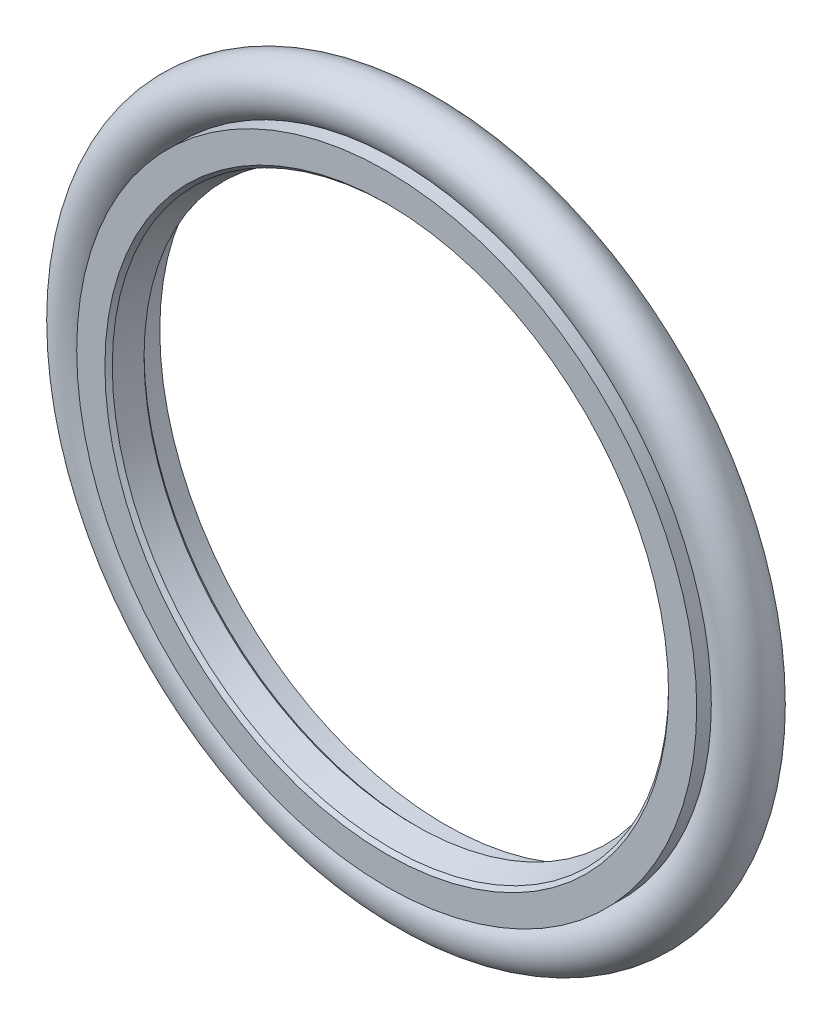
ISO-10303-21;
HEADER;
FILE_DESCRIPTION(('STEP AP214'),'2;1');
FILE_NAME('part.step','',(''),(''),'','','');
FILE_SCHEMA(('AUTOMOTIVE_DESIGN { 1 0 10303 214 1 1 1 1 }'));
ENDSEC;
DATA;
#1=APPLICATION_CONTEXT('core data for automotive mechanical design processes');
#2=APPLICATION_PROTOCOL_DEFINITION('international standard','automotive_design',2000,#1);
#3=PRODUCT_CONTEXT('',#1,'mechanical');
#4=PRODUCT('Part','Part','',(#3));
#5=PRODUCT_RELATED_PRODUCT_CATEGORY('part','',(#4));
#6=PRODUCT_DEFINITION_FORMATION('','',#4);
#7=PRODUCT_DEFINITION_CONTEXT('part definition',#1,'design');
#8=PRODUCT_DEFINITION('design','',#6,#7);
#9=PRODUCT_DEFINITION_SHAPE('','',#8);
#10=(LENGTH_UNIT() NAMED_UNIT(*) SI_UNIT(.MILLI.,.METRE.));
#11=(NAMED_UNIT(*) PLANE_ANGLE_UNIT() SI_UNIT($,.RADIAN.));
#12=(NAMED_UNIT(*) SI_UNIT($,.STERADIAN.) SOLID_ANGLE_UNIT());
#13=UNCERTAINTY_MEASURE_WITH_UNIT(LENGTH_MEASURE(1.E-05),#10,'distance_accuracy_value','');
#14=(GEOMETRIC_REPRESENTATION_CONTEXT(3) GLOBAL_UNCERTAINTY_ASSIGNED_CONTEXT((#13)) GLOBAL_UNIT_ASSIGNED_CONTEXT((#10,
#11,#12)) REPRESENTATION_CONTEXT('',''));
#15=CARTESIAN_POINT('',(0.,0.,0.));
#16=DIRECTION('',(0.,0.,1.));
#17=DIRECTION('',(1.,0.,0.));
#18=AXIS2_PLACEMENT_3D('',#15,#16,#17);
#19=CARTESIAN_POINT('',(0.,0.,1.975));
#20=DIRECTION('',(0.,0.,-1.));
#21=DIRECTION('',(-1.,0.,0.));
#22=AXIS2_PLACEMENT_3D('',#19,#20,#21);
#23=TOROIDAL_SURFACE('',#22,22.405,1.765);
#24=CARTESIAN_POINT('',(-24.17,0.,1.975));
#25=VERTEX_POINT('',#24);
#26=VERTEX_LOOP('',#25);
#27=FACE_BOUND('',#26,.T.);
#28=ADVANCED_FACE('F49',(#27),#23,.T.);
#29=CLOSED_SHELL('',(#28));
#30=MANIFOLD_SOLID_BREP('B2',#29);
#31=CARTESIAN_POINT('',(0.,0.,0.));
#32=DIRECTION('',(0.,0.,-1.));
#33=DIRECTION('',(-1.,0.,0.));
#34=AXIS2_PLACEMENT_3D('',#31,#32,#33);
#35=CYLINDRICAL_SURFACE('',#34,19.25);
#36=CARTESIAN_POINT('',(0.,0.,0.));
#37=DIRECTION('',(0.,0.,-1.));
#38=DIRECTION('',(-1.,0.,0.));
#39=AXIS2_PLACEMENT_3D('',#36,#37,#38);
#40=CIRCLE('',#39,19.25);
#41=CARTESIAN_POINT('',(-19.25,0.,0.));
#42=VERTEX_POINT('',#41);
#43=EDGE_CURVE('E97',#42,#42,#40,.T.);
#44=ORIENTED_EDGE('',*,*,#43,.T.);
#45=EDGE_LOOP('',(#44));
#46=FACE_BOUND('',#45,.T.);
#47=CARTESIAN_POINT('',(0.,0.,1.56));
#48=DIRECTION('',(0.,0.,-1.));
#49=DIRECTION('',(-1.,0.,0.));
#50=AXIS2_PLACEMENT_3D('',#47,#48,#49);
#51=CIRCLE('',#50,19.25);
#52=CARTESIAN_POINT('',(-19.25,0.,1.56));
#53=VERTEX_POINT('',#52);
#54=EDGE_CURVE('E48',#53,#53,#51,.T.);
#55=ORIENTED_EDGE('',*,*,#54,.F.);
#56=EDGE_LOOP('',(#55));
#57=FACE_BOUND('',#56,.T.);
#58=ADVANCED_FACE('F66',(#46,#57),#35,.F.);
#59=CARTESIAN_POINT('',(0.,0.,1.56));
#60=DIRECTION('',(0.,0.,-1.));
#61=DIRECTION('',(-1.,0.,0.));
#62=AXIS2_PLACEMENT_3D('',#59,#60,#61);
#63=TOROIDAL_SURFACE('',#62,19.,0.25);
#64=ORIENTED_EDGE('',*,*,#54,.T.);
#65=EDGE_LOOP('',(#64));
#66=FACE_BOUND('',#65,.T.);
#67=CARTESIAN_POINT('',(0.,0.,1.81));
#68=DIRECTION('',(0.,0.,-1.));
#69=DIRECTION('',(-1.,0.,0.));
#70=AXIS2_PLACEMENT_3D('',#67,#68,#69);
#71=CIRCLE('',#70,19.);
#72=CARTESIAN_POINT('',(-19.,0.,1.81));
#73=VERTEX_POINT('',#72);
#74=EDGE_CURVE('E72',#73,#73,#71,.T.);
#75=ORIENTED_EDGE('',*,*,#74,.F.);
#76=EDGE_LOOP('',(#75));
#77=FACE_BOUND('',#76,.T.);
#78=ADVANCED_FACE('F115',(#66,#77),#63,.F.);
#79=CARTESIAN_POINT('',(0.,18.5,1.81));
#80=DIRECTION('',(0.,0.,-1.));
#81=DIRECTION('',(-1.,0.,0.));
#82=AXIS2_PLACEMENT_3D('',#79,#80,#81);
#83=PLANE('',#82);
#84=ORIENTED_EDGE('',*,*,#74,.T.);
#85=EDGE_LOOP('',(#84));
#86=FACE_BOUND('',#85,.T.);
#87=CARTESIAN_POINT('',(0.,0.,1.81));
#88=DIRECTION('',(0.,0.,-1.));
#89=DIRECTION('',(-1.,0.,0.));
#90=AXIS2_PLACEMENT_3D('',#87,#88,#89);
#91=CIRCLE('',#90,18.5);
#92=CARTESIAN_POINT('',(-18.5,0.,1.81));
#93=VERTEX_POINT('',#92);
#94=EDGE_CURVE('E76',#93,#93,#91,.T.);
#95=ORIENTED_EDGE('',*,*,#94,.F.);
#96=EDGE_LOOP('',(#95));
#97=FACE_BOUND('',#96,.T.);
#98=ADVANCED_FACE('F119',(#86,#97),#83,.T.);
#99=CARTESIAN_POINT('',(0.,0.,2.06));
#100=DIRECTION('',(0.,0.,-1.));
#101=DIRECTION('',(-1.,0.,0.));
#102=AXIS2_PLACEMENT_3D('',#99,#100,#101);
#103=CONICAL_SURFACE('',#102,18.25,0.785398163397455);
#104=ORIENTED_EDGE('',*,*,#94,.T.);
#105=EDGE_LOOP('',(#104));
#106=FACE_BOUND('',#105,.T.);
#107=CARTESIAN_POINT('',(0.,0.,2.06));
#108=DIRECTION('',(0.,0.,-1.));
#109=DIRECTION('',(-1.,0.,0.));
#110=AXIS2_PLACEMENT_3D('',#107,#108,#109);
#111=CIRCLE('',#110,18.25);
#112=CARTESIAN_POINT('',(-18.25,0.,2.06));
#113=VERTEX_POINT('',#112);
#114=EDGE_CURVE('E80',#113,#113,#111,.T.);
#115=ORIENTED_EDGE('',*,*,#114,.F.);
#116=EDGE_LOOP('',(#115));
#117=FACE_BOUND('',#116,.T.);
#118=ADVANCED_FACE('F123',(#106,#117),#103,.F.);
#119=CARTESIAN_POINT('',(0.,0.,3.7));
#120=DIRECTION('',(0.,0.,1.));
#121=DIRECTION('',(1.,0.,0.));
#122=AXIS2_PLACEMENT_3D('',#119,#120,#121);
#123=CONICAL_SURFACE('',#122,18.7513983175922,0.29670597283903);
#124=ORIENTED_EDGE('',*,*,#114,.T.);
#125=EDGE_LOOP('',(#124));
#126=FACE_BOUND('',#125,.T.);
#127=CARTESIAN_POINT('',(0.,0.,3.7));
#128=DIRECTION('',(0.,0.,-1.));
#129=DIRECTION('',(-1.,0.,0.));
#130=AXIS2_PLACEMENT_3D('',#127,#128,#129);
#131=CIRCLE('',#130,18.7513983175922);
#132=CARTESIAN_POINT('',(-18.7513983175922,0.,3.7));
#133=VERTEX_POINT('',#132);
#134=EDGE_CURVE('E85',#133,#133,#131,.T.);
#135=ORIENTED_EDGE('',*,*,#134,.F.);
#136=EDGE_LOOP('',(#135));
#137=FACE_BOUND('',#136,.T.);
#138=ADVANCED_FACE('F129',(#126,#137),#123,.F.);
#139=CARTESIAN_POINT('',(0.,0.,3.95));
#140=DIRECTION('',(0.,0.,1.));
#141=DIRECTION('',(1.,0.,0.));
#142=AXIS2_PLACEMENT_3D('',#139,#140,#141);
#143=CONICAL_SURFACE('',#142,19.,0.782593692462877);
#144=ORIENTED_EDGE('',*,*,#134,.T.);
#145=EDGE_LOOP('',(#144));
#146=FACE_BOUND('',#145,.T.);
#147=CARTESIAN_POINT('',(0.,0.,3.95));
#148=DIRECTION('',(0.,0.,-1.));
#149=DIRECTION('',(-1.,0.,0.));
#150=AXIS2_PLACEMENT_3D('',#147,#148,#149);
#151=CIRCLE('',#150,19.);
#152=CARTESIAN_POINT('',(-19.,0.,3.95));
#153=VERTEX_POINT('',#152);
#154=EDGE_CURVE('E88',#153,#153,#151,.T.);
#155=ORIENTED_EDGE('',*,*,#154,.F.);
#156=EDGE_LOOP('',(#155));
#157=FACE_BOUND('',#156,.T.);
#158=ADVANCED_FACE('F133',(#146,#157),#143,.F.);
#159=CARTESIAN_POINT('',(0.,20.9,3.95));
#160=DIRECTION('',(0.,0.,1.));
#161=DIRECTION('',(1.,0.,0.));
#162=AXIS2_PLACEMENT_3D('',#159,#160,#161);
#163=PLANE('',#162);
#164=ORIENTED_EDGE('',*,*,#154,.T.);
#165=EDGE_LOOP('',(#164));
#166=FACE_BOUND('',#165,.T.);
#167=CARTESIAN_POINT('',(0.,0.,3.95));
#168=DIRECTION('',(0.,0.,-1.));
#169=DIRECTION('',(-1.,0.,0.));
#170=AXIS2_PLACEMENT_3D('',#167,#168,#169);
#171=CIRCLE('',#170,20.9);
#172=CARTESIAN_POINT('',(-20.9,0.,3.95));
#173=VERTEX_POINT('',#172);
#174=EDGE_CURVE('E91',#173,#173,#171,.T.);
#175=ORIENTED_EDGE('',*,*,#174,.F.);
#176=EDGE_LOOP('',(#175));
#177=FACE_BOUND('',#176,.T.);
#178=ADVANCED_FACE('F111',(#166,#177),#163,.T.);
#179=CARTESIAN_POINT('',(0.,0.,0.));
#180=DIRECTION('',(0.,0.,-1.));
#181=DIRECTION('',(-1.,0.,0.));
#182=AXIS2_PLACEMENT_3D('',#179,#180,#181);
#183=CYLINDRICAL_SURFACE('',#182,20.9);
#184=ORIENTED_EDGE('',*,*,#174,.T.);
#185=EDGE_LOOP('',(#184));
#186=FACE_BOUND('',#185,.T.);
#187=CARTESIAN_POINT('',(0.,0.,0.));
#188=DIRECTION('',(0.,0.,-1.));
#189=DIRECTION('',(-1.,0.,0.));
#190=AXIS2_PLACEMENT_3D('',#187,#188,#189);
#191=CIRCLE('',#190,20.9);
#192=CARTESIAN_POINT('',(-20.9,0.,0.));
#193=VERTEX_POINT('',#192);
#194=EDGE_CURVE('E94',#193,#193,#191,.T.);
#195=ORIENTED_EDGE('',*,*,#194,.F.);
#196=EDGE_LOOP('',(#195));
#197=FACE_BOUND('',#196,.T.);
#198=ADVANCED_FACE('F105',(#186,#197),#183,.T.);
#199=CARTESIAN_POINT('',(0.,19.25,0.));
#200=DIRECTION('',(0.,0.,-1.));
#201=DIRECTION('',(-1.,0.,0.));
#202=AXIS2_PLACEMENT_3D('',#199,#200,#201);
#203=PLANE('',#202);
#204=ORIENTED_EDGE('',*,*,#194,.T.);
#205=EDGE_LOOP('',(#204));
#206=FACE_BOUND('',#205,.T.);
#207=ORIENTED_EDGE('',*,*,#43,.F.);
#208=EDGE_LOOP('',(#207));
#209=FACE_BOUND('',#208,.T.);
#210=ADVANCED_FACE('F103',(#206,#209),#203,.T.);
#211=CLOSED_SHELL('',(#58,#78,#98,#118,#138,#158,#178,#198,#210));
#212=MANIFOLD_SOLID_BREP('B6',#211);
#213=ADVANCED_BREP_SHAPE_REPRESENTATION('',(#18,#30,#212),#14);
#214=SHAPE_DEFINITION_REPRESENTATION(#9,#213);
ENDSEC;
END-ISO-10303-21;
